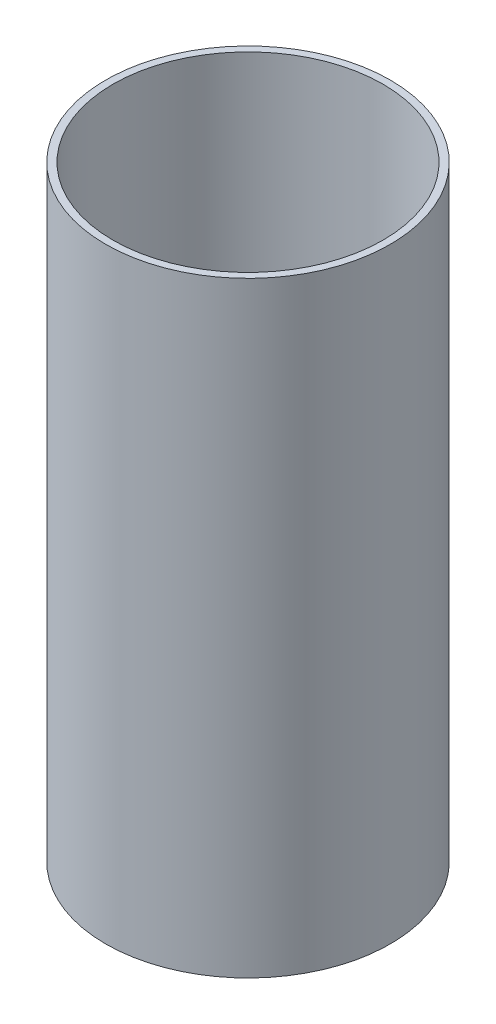
ISO-10303-21;
HEADER;
FILE_DESCRIPTION(('STEP AP214'),'2;1');
FILE_NAME('part.step','',(''),(''),'','','');
FILE_SCHEMA(('AUTOMOTIVE_DESIGN { 1 0 10303 214 1 1 1 1 }'));
ENDSEC;
DATA;
#1=APPLICATION_CONTEXT('core data for automotive mechanical design processes');
#2=APPLICATION_PROTOCOL_DEFINITION('international standard','automotive_design',2000,#1);
#3=PRODUCT_CONTEXT('',#1,'mechanical');
#4=PRODUCT('Part','Part','',(#3));
#5=PRODUCT_RELATED_PRODUCT_CATEGORY('part','',(#4));
#6=PRODUCT_DEFINITION_FORMATION('','',#4);
#7=PRODUCT_DEFINITION_CONTEXT('part definition',#1,'design');
#8=PRODUCT_DEFINITION('design','',#6,#7);
#9=PRODUCT_DEFINITION_SHAPE('','',#8);
#10=(LENGTH_UNIT() NAMED_UNIT(*) SI_UNIT(.MILLI.,.METRE.));
#11=(NAMED_UNIT(*) PLANE_ANGLE_UNIT() SI_UNIT($,.RADIAN.));
#12=(NAMED_UNIT(*) SI_UNIT($,.STERADIAN.) SOLID_ANGLE_UNIT());
#13=UNCERTAINTY_MEASURE_WITH_UNIT(LENGTH_MEASURE(1.E-05),#10,'distance_accuracy_value','');
#14=(GEOMETRIC_REPRESENTATION_CONTEXT(3) GLOBAL_UNCERTAINTY_ASSIGNED_CONTEXT((#13)) GLOBAL_UNIT_ASSIGNED_CONTEXT((#10,
#11,#12)) REPRESENTATION_CONTEXT('',''));
#15=CARTESIAN_POINT('',(0.,0.,0.));
#16=DIRECTION('',(0.,0.,1.));
#17=DIRECTION('',(1.,0.,0.));
#18=AXIS2_PLACEMENT_3D('',#15,#16,#17);
#19=CARTESIAN_POINT('',(0.,199.39,0.));
#20=DIRECTION('',(0.,1.,0.));
#21=DIRECTION('',(0.,0.,1.));
#22=AXIS2_PLACEMENT_3D('',#19,#20,#21);
#23=PLANE('',#22);
#24=CARTESIAN_POINT('',(0.,199.39,0.));
#25=DIRECTION('',(0.,1.,0.));
#26=DIRECTION('',(0.,0.,1.));
#27=AXIS2_PLACEMENT_3D('',#24,#25,#26);
#28=CIRCLE('',#27,93.6625);
#29=CARTESIAN_POINT('',(0.,199.39,93.6625));
#30=VERTEX_POINT('',#29);
#31=EDGE_CURVE('E10',#30,#30,#28,.T.);
#32=ORIENTED_EDGE('',*,*,#31,.T.);
#33=EDGE_LOOP('',(#32));
#34=FACE_BOUND('',#33,.T.);
#35=CARTESIAN_POINT('',(0.,199.39,0.));
#36=DIRECTION('',(0.,1.,0.));
#37=DIRECTION('',(0.,0.,1.));
#38=AXIS2_PLACEMENT_3D('',#35,#36,#37);
#39=CIRCLE('',#38,88.9);
#40=CARTESIAN_POINT('',(0.,199.39,88.9));
#41=VERTEX_POINT('',#40);
#42=EDGE_CURVE('E52',#41,#41,#39,.T.);
#43=ORIENTED_EDGE('',*,*,#42,.F.);
#44=EDGE_LOOP('',(#43));
#45=FACE_BOUND('',#44,.T.);
#46=ADVANCED_FACE('F41',(#34,#45),#23,.T.);
#47=CARTESIAN_POINT('',(0.,-199.39,0.));
#48=DIRECTION('',(0.,1.,0.));
#49=DIRECTION('',(0.,0.,1.));
#50=AXIS2_PLACEMENT_3D('',#47,#48,#49);
#51=PLANE('',#50);
#52=CARTESIAN_POINT('',(0.,-199.39,0.));
#53=DIRECTION('',(0.,1.,0.));
#54=DIRECTION('',(0.,0.,1.));
#55=AXIS2_PLACEMENT_3D('',#52,#53,#54);
#56=CIRCLE('',#55,93.6625);
#57=CARTESIAN_POINT('',(0.,-199.39,93.6625));
#58=VERTEX_POINT('',#57);
#59=EDGE_CURVE('E45',#58,#58,#56,.T.);
#60=ORIENTED_EDGE('',*,*,#59,.F.);
#61=EDGE_LOOP('',(#60));
#62=FACE_BOUND('',#61,.T.);
#63=CARTESIAN_POINT('',(0.,-199.39,0.));
#64=DIRECTION('',(0.,1.,0.));
#65=DIRECTION('',(0.,0.,1.));
#66=AXIS2_PLACEMENT_3D('',#63,#64,#65);
#67=CIRCLE('',#66,88.9);
#68=CARTESIAN_POINT('',(0.,-199.39,88.9));
#69=VERTEX_POINT('',#68);
#70=EDGE_CURVE('E54',#69,#69,#67,.T.);
#71=ORIENTED_EDGE('',*,*,#70,.T.);
#72=EDGE_LOOP('',(#71));
#73=FACE_BOUND('',#72,.T.);
#74=ADVANCED_FACE('F64',(#62,#73),#51,.F.);
#75=CARTESIAN_POINT('',(0.,199.39,0.));
#76=DIRECTION('',(0.,-1.,0.));
#77=DIRECTION('',(0.,0.,-1.));
#78=AXIS2_PLACEMENT_3D('',#75,#76,#77);
#79=CYLINDRICAL_SURFACE('',#78,93.6625);
#80=ORIENTED_EDGE('',*,*,#31,.F.);
#81=EDGE_LOOP('',(#80));
#82=FACE_BOUND('',#81,.T.);
#83=ORIENTED_EDGE('',*,*,#59,.T.);
#84=EDGE_LOOP('',(#83));
#85=FACE_BOUND('',#84,.T.);
#86=ADVANCED_FACE('F43',(#82,#85),#79,.T.);
#87=CARTESIAN_POINT('',(0.,199.39,0.));
#88=DIRECTION('',(0.,-1.,0.));
#89=DIRECTION('',(0.,0.,-1.));
#90=AXIS2_PLACEMENT_3D('',#87,#88,#89);
#91=CYLINDRICAL_SURFACE('',#90,88.9);
#92=ORIENTED_EDGE('',*,*,#42,.T.);
#93=EDGE_LOOP('',(#92));
#94=FACE_BOUND('',#93,.T.);
#95=ORIENTED_EDGE('',*,*,#70,.F.);
#96=EDGE_LOOP('',(#95));
#97=FACE_BOUND('',#96,.T.);
#98=ADVANCED_FACE('F60',(#94,#97),#91,.F.);
#99=CLOSED_SHELL('',(#46,#74,#86,#98));
#100=MANIFOLD_SOLID_BREP('B2',#99);
#101=ADVANCED_BREP_SHAPE_REPRESENTATION('',(#18,#100),#14);
#102=SHAPE_DEFINITION_REPRESENTATION(#9,#101);
ENDSEC;
END-ISO-10303-21;
